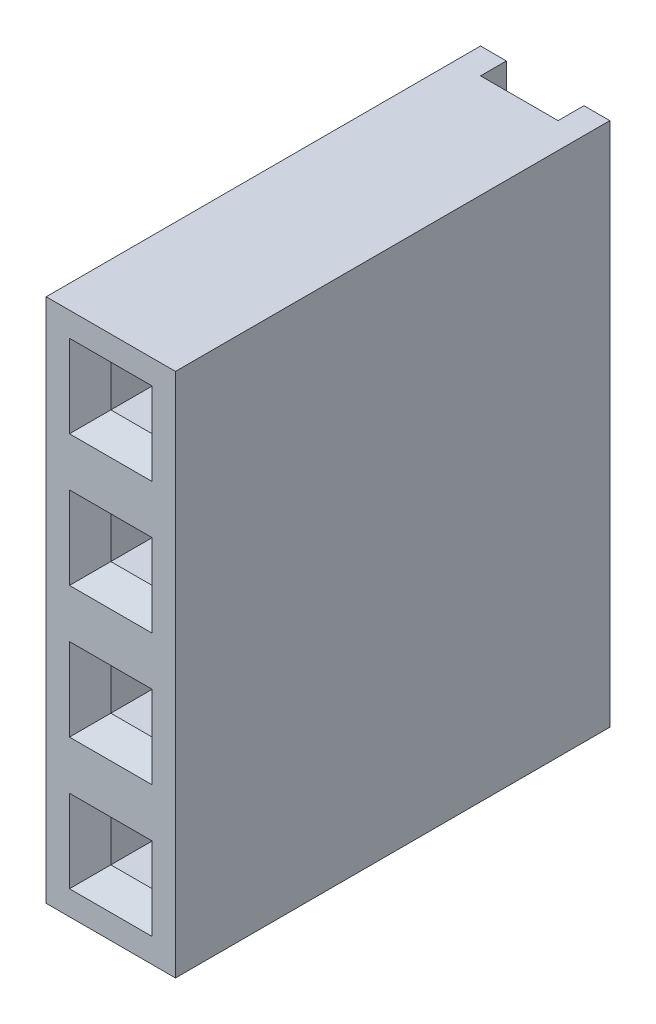
ISO-10303-21;
HEADER;
FILE_DESCRIPTION(('STEP AP214'),'2;1');
FILE_NAME('part.step','',(''),(''),'','','');
FILE_SCHEMA(('AUTOMOTIVE_DESIGN { 1 0 10303 214 1 1 1 1 }'));
ENDSEC;
DATA;
#1=APPLICATION_CONTEXT('core data for automotive mechanical design processes');
#2=APPLICATION_PROTOCOL_DEFINITION('international standard','automotive_design',2000,#1);
#3=PRODUCT_CONTEXT('',#1,'mechanical');
#4=PRODUCT('Part','Part','',(#3));
#5=PRODUCT_RELATED_PRODUCT_CATEGORY('part','',(#4));
#6=PRODUCT_DEFINITION_FORMATION('','',#4);
#7=PRODUCT_DEFINITION_CONTEXT('part definition',#1,'design');
#8=PRODUCT_DEFINITION('design','',#6,#7);
#9=PRODUCT_DEFINITION_SHAPE('','',#8);
#10=(LENGTH_UNIT() NAMED_UNIT(*) SI_UNIT(.MILLI.,.METRE.));
#11=(NAMED_UNIT(*) PLANE_ANGLE_UNIT() SI_UNIT($,.RADIAN.));
#12=(NAMED_UNIT(*) SI_UNIT($,.STERADIAN.) SOLID_ANGLE_UNIT());
#13=UNCERTAINTY_MEASURE_WITH_UNIT(LENGTH_MEASURE(1.E-05),#10,'distance_accuracy_value','');
#14=(GEOMETRIC_REPRESENTATION_CONTEXT(3) GLOBAL_UNCERTAINTY_ASSIGNED_CONTEXT((#13)) GLOBAL_UNIT_ASSIGNED_CONTEXT((#10,
#11,#12)) REPRESENTATION_CONTEXT('',''));
#15=CARTESIAN_POINT('',(0.,0.,0.));
#16=DIRECTION('',(0.,0.,1.));
#17=DIRECTION('',(1.,0.,0.));
#18=AXIS2_PLACEMENT_3D('',#15,#16,#17);
#19=CARTESIAN_POINT('',(-1.25,0.,0.));
#20=DIRECTION('',(1.,0.,0.));
#21=DIRECTION('',(0.,0.,-1.));
#22=AXIS2_PLACEMENT_3D('',#19,#20,#21);
#23=PLANE('',#22);
#24=DIRECTION('',(0.,0.,1.));
#25=VECTOR('',#24,1.);
#26=CARTESIAN_POINT('',(-1.25,12.7,0.));
#27=LINE('',#26,#25);
#28=CARTESIAN_POINT('',(-1.25,12.7,0.));
#29=VERTEX_POINT('',#28);
#30=CARTESIAN_POINT('',(-1.25,12.7,8.4));
#31=VERTEX_POINT('',#30);
#32=EDGE_CURVE('E11',#29,#31,#27,.T.);
#33=ORIENTED_EDGE('',*,*,#32,.F.);
#34=DIRECTION('',(0.,1.,0.));
#35=VECTOR('',#34,1.);
#36=CARTESIAN_POINT('',(-1.25,0.,0.));
#37=LINE('',#36,#35);
#38=CARTESIAN_POINT('',(-1.25,2.54,0.));
#39=VERTEX_POINT('',#38);
#40=EDGE_CURVE('E24',#39,#29,#37,.T.);
#41=ORIENTED_EDGE('',*,*,#40,.F.);
#42=DIRECTION('',(0.,0.,-1.));
#43=VECTOR('',#42,1.);
#44=CARTESIAN_POINT('',(-1.25,2.54,0.));
#45=LINE('',#44,#43);
#46=CARTESIAN_POINT('',(-1.25,2.54,8.4));
#47=VERTEX_POINT('',#46);
#48=EDGE_CURVE('E499',#47,#39,#45,.T.);
#49=ORIENTED_EDGE('',*,*,#48,.F.);
#50=DIRECTION('',(0.,-1.,0.));
#51=VECTOR('',#50,1.);
#52=CARTESIAN_POINT('',(-1.25,0.,8.4));
#53=LINE('',#52,#51);
#54=EDGE_CURVE('E496',#31,#47,#53,.T.);
#55=ORIENTED_EDGE('',*,*,#54,.F.);
#56=EDGE_LOOP('',(#33,#41,#49,#55));
#57=FACE_BOUND('',#56,.T.);
#58=ADVANCED_FACE('F17',(#57),#23,.F.);
#59=CARTESIAN_POINT('',(0.,2.54,8.4));
#60=DIRECTION('',(0.,0.,-1.));
#61=DIRECTION('',(-1.,0.,0.));
#62=AXIS2_PLACEMENT_3D('',#59,#60,#61);
#63=PLANE('',#62);
#64=DIRECTION('',(1.,0.,0.));
#65=VECTOR('',#64,1.);
#66=CARTESIAN_POINT('',(0.,10.63,8.4));
#67=LINE('',#66,#65);
#68=CARTESIAN_POINT('',(-0.8,10.63,8.4));
#69=VERTEX_POINT('',#68);
#70=CARTESIAN_POINT('',(0.800000000000001,10.63,8.4));
#71=VERTEX_POINT('',#70);
#72=EDGE_CURVE('E494',#69,#71,#67,.T.);
#73=ORIENTED_EDGE('',*,*,#72,.F.);
#74=DIRECTION('',(0.,-1.,0.));
#75=VECTOR('',#74,1.);
#76=CARTESIAN_POINT('',(-0.8,2.54,8.4));
#77=LINE('',#76,#75);
#78=CARTESIAN_POINT('',(-0.800000000000001,12.23,8.4));
#79=VERTEX_POINT('',#78);
#80=EDGE_CURVE('E491',#79,#69,#77,.T.);
#81=ORIENTED_EDGE('',*,*,#80,.F.);
#82=DIRECTION('',(-1.,0.,0.));
#83=VECTOR('',#82,1.);
#84=CARTESIAN_POINT('',(0.,12.23,8.4));
#85=LINE('',#84,#83);
#86=CARTESIAN_POINT('',(0.8,12.23,8.4));
#87=VERTEX_POINT('',#86);
#88=EDGE_CURVE('E488',#87,#79,#85,.T.);
#89=ORIENTED_EDGE('',*,*,#88,.F.);
#90=DIRECTION('',(0.,1.,0.));
#91=VECTOR('',#90,1.);
#92=CARTESIAN_POINT('',(0.8,2.54,8.4));
#93=LINE('',#92,#91);
#94=EDGE_CURVE('E485',#71,#87,#93,.T.);
#95=ORIENTED_EDGE('',*,*,#94,.F.);
#96=EDGE_LOOP('',(#73,#81,#89,#95));
#97=FACE_BOUND('',#96,.T.);
#98=DIRECTION('',(0.,1.,0.));
#99=VECTOR('',#98,1.);
#100=CARTESIAN_POINT('',(0.8,2.54,8.4));
#101=LINE('',#100,#99);
#102=CARTESIAN_POINT('',(0.800000000000001,8.09,8.4));
#103=VERTEX_POINT('',#102);
#104=CARTESIAN_POINT('',(0.8,9.69,8.4));
#105=VERTEX_POINT('',#104);
#106=EDGE_CURVE('E483',#103,#105,#101,.T.);
#107=ORIENTED_EDGE('',*,*,#106,.F.);
#108=DIRECTION('',(1.,0.,0.));
#109=VECTOR('',#108,1.);
#110=CARTESIAN_POINT('',(0.,8.09,8.4));
#111=LINE('',#110,#109);
#112=CARTESIAN_POINT('',(-0.8,8.09,8.4));
#113=VERTEX_POINT('',#112);
#114=EDGE_CURVE('E480',#113,#103,#111,.T.);
#115=ORIENTED_EDGE('',*,*,#114,.F.);
#116=DIRECTION('',(0.,-1.,0.));
#117=VECTOR('',#116,1.);
#118=CARTESIAN_POINT('',(-0.8,2.54,8.4));
#119=LINE('',#118,#117);
#120=CARTESIAN_POINT('',(-0.800000000000001,9.69,8.4));
#121=VERTEX_POINT('',#120);
#122=EDGE_CURVE('E477',#121,#113,#119,.T.);
#123=ORIENTED_EDGE('',*,*,#122,.F.);
#124=DIRECTION('',(-1.,0.,0.));
#125=VECTOR('',#124,1.);
#126=CARTESIAN_POINT('',(0.,9.69,8.4));
#127=LINE('',#126,#125);
#128=EDGE_CURVE('E474',#105,#121,#127,.T.);
#129=ORIENTED_EDGE('',*,*,#128,.F.);
#130=EDGE_LOOP('',(#107,#115,#123,#129));
#131=FACE_BOUND('',#130,.T.);
#132=DIRECTION('',(0.,1.,0.));
#133=VECTOR('',#132,1.);
#134=CARTESIAN_POINT('',(0.8,2.54,8.4));
#135=LINE('',#134,#133);
#136=CARTESIAN_POINT('',(0.800000000000001,5.55,8.4));
#137=VERTEX_POINT('',#136);
#138=CARTESIAN_POINT('',(0.8,7.15,8.4));
#139=VERTEX_POINT('',#138);
#140=EDGE_CURVE('E472',#137,#139,#135,.T.);
#141=ORIENTED_EDGE('',*,*,#140,.F.);
#142=DIRECTION('',(1.,0.,0.));
#143=VECTOR('',#142,1.);
#144=CARTESIAN_POINT('',(0.,5.55,8.4));
#145=LINE('',#144,#143);
#146=CARTESIAN_POINT('',(-0.8,5.55,8.4));
#147=VERTEX_POINT('',#146);
#148=EDGE_CURVE('E469',#147,#137,#145,.T.);
#149=ORIENTED_EDGE('',*,*,#148,.F.);
#150=DIRECTION('',(0.,-1.,0.));
#151=VECTOR('',#150,1.);
#152=CARTESIAN_POINT('',(-0.8,2.54,8.4));
#153=LINE('',#152,#151);
#154=CARTESIAN_POINT('',(-0.800000000000001,7.15,8.4));
#155=VERTEX_POINT('',#154);
#156=EDGE_CURVE('E466',#155,#147,#153,.T.);
#157=ORIENTED_EDGE('',*,*,#156,.F.);
#158=DIRECTION('',(-1.,0.,0.));
#159=VECTOR('',#158,1.);
#160=CARTESIAN_POINT('',(0.,7.15,8.4));
#161=LINE('',#160,#159);
#162=EDGE_CURVE('E463',#139,#155,#161,.T.);
#163=ORIENTED_EDGE('',*,*,#162,.F.);
#164=EDGE_LOOP('',(#141,#149,#157,#163));
#165=FACE_BOUND('',#164,.T.);
#166=DIRECTION('',(0.,1.,0.));
#167=VECTOR('',#166,1.);
#168=CARTESIAN_POINT('',(0.8,2.54,8.4));
#169=LINE('',#168,#167);
#170=CARTESIAN_POINT('',(0.800000000000002,3.01,8.4));
#171=VERTEX_POINT('',#170);
#172=CARTESIAN_POINT('',(0.8,4.61,8.4));
#173=VERTEX_POINT('',#172);
#174=EDGE_CURVE('E461',#171,#173,#169,.T.);
#175=ORIENTED_EDGE('',*,*,#174,.F.);
#176=DIRECTION('',(1.,0.,0.));
#177=VECTOR('',#176,1.);
#178=CARTESIAN_POINT('',(0.,3.01,8.4));
#179=LINE('',#178,#177);
#180=CARTESIAN_POINT('',(-0.8,3.01,8.4));
#181=VERTEX_POINT('',#180);
#182=EDGE_CURVE('E458',#181,#171,#179,.T.);
#183=ORIENTED_EDGE('',*,*,#182,.F.);
#184=DIRECTION('',(0.,-1.,0.));
#185=VECTOR('',#184,1.);
#186=CARTESIAN_POINT('',(-0.8,2.54,8.4));
#187=LINE('',#186,#185);
#188=CARTESIAN_POINT('',(-0.800000000000001,4.61,8.4));
#189=VERTEX_POINT('',#188);
#190=EDGE_CURVE('E455',#189,#181,#187,.T.);
#191=ORIENTED_EDGE('',*,*,#190,.F.);
#192=DIRECTION('',(-1.,0.,0.));
#193=VECTOR('',#192,1.);
#194=CARTESIAN_POINT('',(0.,4.61,8.4));
#195=LINE('',#194,#193);
#196=EDGE_CURVE('E452',#173,#189,#195,.T.);
#197=ORIENTED_EDGE('',*,*,#196,.F.);
#198=EDGE_LOOP('',(#175,#183,#191,#197));
#199=FACE_BOUND('',#198,.T.);
#200=ORIENTED_EDGE('',*,*,#54,.T.);
#201=DIRECTION('',(-1.,0.,0.));
#202=VECTOR('',#201,1.);
#203=CARTESIAN_POINT('',(0.,2.54,8.4));
#204=LINE('',#203,#202);
#205=CARTESIAN_POINT('',(1.25,2.54,8.4));
#206=VERTEX_POINT('',#205);
#207=EDGE_CURVE('E449',#206,#47,#204,.T.);
#208=ORIENTED_EDGE('',*,*,#207,.F.);
#209=DIRECTION('',(0.,-1.,0.));
#210=VECTOR('',#209,1.);
#211=CARTESIAN_POINT('',(1.25,2.54,8.4));
#212=LINE('',#211,#210);
#213=CARTESIAN_POINT('',(1.25,12.7,8.4));
#214=VERTEX_POINT('',#213);
#215=EDGE_CURVE('E446',#214,#206,#212,.T.);
#216=ORIENTED_EDGE('',*,*,#215,.F.);
#217=DIRECTION('',(1.,0.,0.));
#218=VECTOR('',#217,1.);
#219=CARTESIAN_POINT('',(0.,12.7,8.4));
#220=LINE('',#219,#218);
#221=EDGE_CURVE('E444',#31,#214,#220,.T.);
#222=ORIENTED_EDGE('',*,*,#221,.F.);
#223=EDGE_LOOP('',(#200,#208,#216,#222));
#224=FACE_BOUND('',#223,.T.);
#225=ADVANCED_FACE('F517',(#97,#131,#165,#199,#224),#63,.F.);
#226=CARTESIAN_POINT('',(0.,12.7,0.));
#227=DIRECTION('',(0.,1.,0.));
#228=DIRECTION('',(0.,0.,1.));
#229=AXIS2_PLACEMENT_3D('',#226,#227,#228);
#230=PLANE('',#229);
#231=DIRECTION('',(1.,0.,0.));
#232=VECTOR('',#231,1.);
#233=CARTESIAN_POINT('',(-0.75,12.7,0.5));
#234=LINE('',#233,#232);
#235=CARTESIAN_POINT('',(-0.75,12.7,0.5));
#236=VERTEX_POINT('',#235);
#237=CARTESIAN_POINT('',(0.75,12.7,0.5));
#238=VERTEX_POINT('',#237);
#239=EDGE_CURVE('E442',#236,#238,#234,.T.);
#240=ORIENTED_EDGE('',*,*,#239,.F.);
#241=DIRECTION('',(0.,0.,1.));
#242=VECTOR('',#241,1.);
#243=CARTESIAN_POINT('',(-0.75,12.7,0.));
#244=LINE('',#243,#242);
#245=CARTESIAN_POINT('',(-0.75,12.7,0.));
#246=VERTEX_POINT('',#245);
#247=EDGE_CURVE('E439',#246,#236,#244,.T.);
#248=ORIENTED_EDGE('',*,*,#247,.F.);
#249=DIRECTION('',(-1.,0.,0.));
#250=VECTOR('',#249,1.);
#251=CARTESIAN_POINT('',(0.,12.7,0.));
#252=LINE('',#251,#250);
#253=EDGE_CURVE('E437',#246,#29,#252,.T.);
#254=ORIENTED_EDGE('',*,*,#253,.T.);
#255=ORIENTED_EDGE('',*,*,#32,.T.);
#256=ORIENTED_EDGE('',*,*,#221,.T.);
#257=DIRECTION('',(0.,0.,-1.));
#258=VECTOR('',#257,1.);
#259=CARTESIAN_POINT('',(1.25,12.7,0.));
#260=LINE('',#259,#258);
#261=CARTESIAN_POINT('',(1.25,12.7,0.));
#262=VERTEX_POINT('',#261);
#263=EDGE_CURVE('E435',#214,#262,#260,.T.);
#264=ORIENTED_EDGE('',*,*,#263,.T.);
#265=DIRECTION('',(-1.,0.,0.));
#266=VECTOR('',#265,1.);
#267=CARTESIAN_POINT('',(0.,12.7,0.));
#268=LINE('',#267,#266);
#269=CARTESIAN_POINT('',(0.75,12.7,0.));
#270=VERTEX_POINT('',#269);
#271=EDGE_CURVE('E433',#262,#270,#268,.T.);
#272=ORIENTED_EDGE('',*,*,#271,.T.);
#273=DIRECTION('',(0.,0.,-1.));
#274=VECTOR('',#273,1.);
#275=CARTESIAN_POINT('',(0.75,12.7,0.5));
#276=LINE('',#275,#274);
#277=EDGE_CURVE('E430',#238,#270,#276,.T.);
#278=ORIENTED_EDGE('',*,*,#277,.F.);
#279=EDGE_LOOP('',(#240,#248,#254,#255,#256,#264,#272,#278));
#280=FACE_BOUND('',#279,.T.);
#281=ADVANCED_FACE('F506',(#280),#230,.T.);
#282=CARTESIAN_POINT('',(0.,12.7,0.));
#283=DIRECTION('',(0.,0.,1.));
#284=DIRECTION('',(1.,0.,0.));
#285=AXIS2_PLACEMENT_3D('',#282,#283,#284);
#286=PLANE('',#285);
#287=DIRECTION('',(1.,0.,0.));
#288=VECTOR('',#287,1.);
#289=CARTESIAN_POINT('',(0.,2.54,0.));
#290=LINE('',#289,#288);
#291=CARTESIAN_POINT('',(-0.75,2.54,0.));
#292=VERTEX_POINT('',#291);
#293=EDGE_CURVE('E428',#39,#292,#290,.T.);
#294=ORIENTED_EDGE('',*,*,#293,.F.);
#295=ORIENTED_EDGE('',*,*,#40,.T.);
#296=ORIENTED_EDGE('',*,*,#253,.F.);
#297=DIRECTION('',(0.,1.,0.));
#298=VECTOR('',#297,1.);
#299=CARTESIAN_POINT('',(-0.75,12.7,0.));
#300=LINE('',#299,#298);
#301=EDGE_CURVE('E425',#292,#246,#300,.T.);
#302=ORIENTED_EDGE('',*,*,#301,.F.);
#303=EDGE_LOOP('',(#294,#295,#296,#302));
#304=FACE_BOUND('',#303,.T.);
#305=ADVANCED_FACE('F504',(#304),#286,.F.);
#306=CARTESIAN_POINT('',(0.,2.54,8.4));
#307=DIRECTION('',(0.,-1.,0.));
#308=DIRECTION('',(0.,0.,-1.));
#309=AXIS2_PLACEMENT_3D('',#306,#307,#308);
#310=PLANE('',#309);
#311=DIRECTION('',(-1.,0.,0.));
#312=VECTOR('',#311,1.);
#313=CARTESIAN_POINT('',(-0.75,2.54,0.5));
#314=LINE('',#313,#312);
#315=CARTESIAN_POINT('',(0.75,2.54,0.5));
#316=VERTEX_POINT('',#315);
#317=CARTESIAN_POINT('',(-0.75,2.54,0.5));
#318=VERTEX_POINT('',#317);
#319=EDGE_CURVE('E423',#316,#318,#314,.T.);
#320=ORIENTED_EDGE('',*,*,#319,.F.);
#321=DIRECTION('',(0.,0.,1.));
#322=VECTOR('',#321,1.);
#323=CARTESIAN_POINT('',(0.75,2.54,0.5));
#324=LINE('',#323,#322);
#325=CARTESIAN_POINT('',(0.75,2.54,0.));
#326=VERTEX_POINT('',#325);
#327=EDGE_CURVE('E420',#326,#316,#324,.T.);
#328=ORIENTED_EDGE('',*,*,#327,.F.);
#329=DIRECTION('',(1.,0.,0.));
#330=VECTOR('',#329,1.);
#331=CARTESIAN_POINT('',(0.,2.54,0.));
#332=LINE('',#331,#330);
#333=CARTESIAN_POINT('',(1.25,2.54,0.));
#334=VERTEX_POINT('',#333);
#335=EDGE_CURVE('E418',#326,#334,#332,.T.);
#336=ORIENTED_EDGE('',*,*,#335,.T.);
#337=DIRECTION('',(0.,0.,1.));
#338=VECTOR('',#337,1.);
#339=CARTESIAN_POINT('',(1.25,2.54,8.4));
#340=LINE('',#339,#338);
#341=EDGE_CURVE('E415',#334,#206,#340,.T.);
#342=ORIENTED_EDGE('',*,*,#341,.T.);
#343=ORIENTED_EDGE('',*,*,#207,.T.);
#344=ORIENTED_EDGE('',*,*,#48,.T.);
#345=ORIENTED_EDGE('',*,*,#293,.T.);
#346=DIRECTION('',(0.,0.,1.));
#347=VECTOR('',#346,1.);
#348=CARTESIAN_POINT('',(-0.75,2.54,8.4));
#349=LINE('',#348,#347);
#350=EDGE_CURVE('E412',#292,#318,#349,.T.);
#351=ORIENTED_EDGE('',*,*,#350,.T.);
#352=EDGE_LOOP('',(#320,#328,#336,#342,#343,#344,#345,#351));
#353=FACE_BOUND('',#352,.T.);
#354=ADVANCED_FACE('F514',(#353),#310,.T.);
#355=CARTESIAN_POINT('',(0.4,14.732,8.));
#356=DIRECTION('',(-0.707106781186548,0.,0.707106781186548));
#357=DIRECTION('',(0.707106781186548,0.,0.707106781186548));
#358=AXIS2_PLACEMENT_3D('',#355,#356,#357);
#359=PLANE('',#358);
#360=DIRECTION('',(0.577350269189626,-0.577350269189624,0.577350269189627));
#361=VECTOR('',#360,1.);
#362=CARTESIAN_POINT('',(0.4,11.03,8.));
#363=LINE('',#362,#361);
#364=CARTESIAN_POINT('',(0.4,11.03,8.));
#365=VERTEX_POINT('',#364);
#366=EDGE_CURVE('E409',#365,#71,#363,.T.);
#367=ORIENTED_EDGE('',*,*,#366,.T.);
#368=ORIENTED_EDGE('',*,*,#94,.T.);
#369=DIRECTION('',(-0.577350269189626,-0.577350269189626,-0.577350269189626));
#370=VECTOR('',#369,1.);
#371=CARTESIAN_POINT('',(0.800000000000001,12.23,8.4));
#372=LINE('',#371,#370);
#373=CARTESIAN_POINT('',(0.4,11.83,8.));
#374=VERTEX_POINT('',#373);
#375=EDGE_CURVE('E407',#87,#374,#372,.T.);
#376=ORIENTED_EDGE('',*,*,#375,.T.);
#377=DIRECTION('',(0.,-1.,0.));
#378=VECTOR('',#377,1.);
#379=CARTESIAN_POINT('',(0.4,14.732,8.));
#380=LINE('',#379,#378);
#381=EDGE_CURVE('E404',#374,#365,#380,.T.);
#382=ORIENTED_EDGE('',*,*,#381,.T.);
#383=EDGE_LOOP('',(#367,#368,#376,#382));
#384=FACE_BOUND('',#383,.T.);
#385=ADVANCED_FACE('F558',(#384),#359,.T.);
#386=CARTESIAN_POINT('',(-1.75,11.03,8.));
#387=DIRECTION('',(0.,-0.707106781186548,-0.707106781186548));
#388=DIRECTION('',(0.,0.707106781186548,-0.707106781186548));
#389=AXIS2_PLACEMENT_3D('',#386,#387,#388);
#390=PLANE('',#389);
#391=DIRECTION('',(0.577350269189625,0.577350269189626,-0.577350269189626));
#392=VECTOR('',#391,1.);
#393=CARTESIAN_POINT('',(-0.8,10.63,8.4));
#394=LINE('',#393,#392);
#395=CARTESIAN_POINT('',(-0.4,11.03,8.));
#396=VERTEX_POINT('',#395);
#397=EDGE_CURVE('E402',#69,#396,#394,.T.);
#398=ORIENTED_EDGE('',*,*,#397,.F.);
#399=ORIENTED_EDGE('',*,*,#72,.T.);
#400=ORIENTED_EDGE('',*,*,#366,.F.);
#401=DIRECTION('',(-1.,0.,0.));
#402=VECTOR('',#401,1.);
#403=CARTESIAN_POINT('',(0.4,11.03,8.));
#404=LINE('',#403,#402);
#405=EDGE_CURVE('E399',#365,#396,#404,.T.);
#406=ORIENTED_EDGE('',*,*,#405,.T.);
#407=EDGE_LOOP('',(#398,#399,#400,#406));
#408=FACE_BOUND('',#407,.T.);
#409=ADVANCED_FACE('F561',(#408),#390,.F.);
#410=CARTESIAN_POINT('',(-0.4,0.508,8.));
#411=DIRECTION('',(0.707106781186548,0.,0.707106781186548));
#412=DIRECTION('',(0.707106781186548,0.,-0.707106781186548));
#413=AXIS2_PLACEMENT_3D('',#410,#411,#412);
#414=PLANE('',#413);
#415=DIRECTION('',(-0.577350269189624,0.577350269189629,0.577350269189624));
#416=VECTOR('',#415,1.);
#417=CARTESIAN_POINT('',(-0.4,11.83,8.));
#418=LINE('',#417,#416);
#419=CARTESIAN_POINT('',(-0.4,11.83,8.));
#420=VERTEX_POINT('',#419);
#421=EDGE_CURVE('E396',#420,#79,#418,.T.);
#422=ORIENTED_EDGE('',*,*,#421,.T.);
#423=ORIENTED_EDGE('',*,*,#80,.T.);
#424=ORIENTED_EDGE('',*,*,#397,.T.);
#425=DIRECTION('',(0.,-1.,0.));
#426=VECTOR('',#425,1.);
#427=CARTESIAN_POINT('',(-0.4,11.83,8.));
#428=LINE('',#427,#426);
#429=EDGE_CURVE('E394',#420,#396,#428,.T.);
#430=ORIENTED_EDGE('',*,*,#429,.F.);
#431=EDGE_LOOP('',(#422,#423,#424,#430));
#432=FACE_BOUND('',#431,.T.);
#433=ADVANCED_FACE('F565',(#432),#414,.T.);
#434=CARTESIAN_POINT('',(1.75,11.83,8.));
#435=DIRECTION('',(0.,0.707106781186548,-0.707106781186548));
#436=DIRECTION('',(0.,0.707106781186548,0.707106781186548));
#437=AXIS2_PLACEMENT_3D('',#434,#435,#436);
#438=PLANE('',#437);
#439=ORIENTED_EDGE('',*,*,#375,.F.);
#440=ORIENTED_EDGE('',*,*,#88,.T.);
#441=ORIENTED_EDGE('',*,*,#421,.F.);
#442=DIRECTION('',(1.,0.,0.));
#443=VECTOR('',#442,1.);
#444=CARTESIAN_POINT('',(-0.4,11.83,8.));
#445=LINE('',#444,#443);
#446=EDGE_CURVE('E249',#420,#374,#445,.T.);
#447=ORIENTED_EDGE('',*,*,#446,.T.);
#448=EDGE_LOOP('',(#439,#440,#441,#447));
#449=FACE_BOUND('',#448,.T.);
#450=ADVANCED_FACE('F569',(#449),#438,.F.);
#451=CARTESIAN_POINT('',(1.75,9.29,8.));
#452=DIRECTION('',(0.,0.707106781186548,-0.707106781186548));
#453=DIRECTION('',(0.,0.707106781186548,0.707106781186548));
#454=AXIS2_PLACEMENT_3D('',#451,#452,#453);
#455=PLANE('',#454);
#456=DIRECTION('',(-0.577350269189625,-0.577350269189626,-0.577350269189626));
#457=VECTOR('',#456,1.);
#458=CARTESIAN_POINT('',(0.8,9.69,8.4));
#459=LINE('',#458,#457);
#460=CARTESIAN_POINT('',(0.4,9.29,8.));
#461=VERTEX_POINT('',#460);
#462=EDGE_CURVE('E391',#105,#461,#459,.T.);
#463=ORIENTED_EDGE('',*,*,#462,.F.);
#464=ORIENTED_EDGE('',*,*,#128,.T.);
#465=DIRECTION('',(-0.577350269189625,0.577350269189626,0.577350269189626));
#466=VECTOR('',#465,1.);
#467=CARTESIAN_POINT('',(-0.400000000000001,9.29,8.));
#468=LINE('',#467,#466);
#469=CARTESIAN_POINT('',(-0.4,9.29,8.));
#470=VERTEX_POINT('',#469);
#471=EDGE_CURVE('E388',#470,#121,#468,.T.);
#472=ORIENTED_EDGE('',*,*,#471,.F.);
#473=DIRECTION('',(-1.,0.,0.));
#474=VECTOR('',#473,1.);
#475=CARTESIAN_POINT('',(1.75,9.29,8.));
#476=LINE('',#475,#474);
#477=EDGE_CURVE('E385',#461,#470,#476,.T.);
#478=ORIENTED_EDGE('',*,*,#477,.F.);
#479=EDGE_LOOP('',(#463,#464,#472,#478));
#480=FACE_BOUND('',#479,.T.);
#481=ADVANCED_FACE('F573',(#480),#455,.F.);
#482=CARTESIAN_POINT('',(0.4,14.732,8.));
#483=DIRECTION('',(-0.707106781186548,0.,0.707106781186548));
#484=DIRECTION('',(0.707106781186548,0.,0.707106781186548));
#485=AXIS2_PLACEMENT_3D('',#482,#483,#484);
#486=PLANE('',#485);
#487=DIRECTION('',(0.577350269189626,-0.577350269189626,0.577350269189626));
#488=VECTOR('',#487,1.);
#489=CARTESIAN_POINT('',(0.4,8.49,8.));
#490=LINE('',#489,#488);
#491=CARTESIAN_POINT('',(0.4,8.49,8.));
#492=VERTEX_POINT('',#491);
#493=EDGE_CURVE('E382',#492,#103,#490,.T.);
#494=ORIENTED_EDGE('',*,*,#493,.T.);
#495=ORIENTED_EDGE('',*,*,#106,.T.);
#496=ORIENTED_EDGE('',*,*,#462,.T.);
#497=DIRECTION('',(0.,1.,0.));
#498=VECTOR('',#497,1.);
#499=CARTESIAN_POINT('',(0.4,11.03,8.));
#500=LINE('',#499,#498);
#501=EDGE_CURVE('E379',#492,#461,#500,.T.);
#502=ORIENTED_EDGE('',*,*,#501,.F.);
#503=EDGE_LOOP('',(#494,#495,#496,#502));
#504=FACE_BOUND('',#503,.T.);
#505=ADVANCED_FACE('F577',(#504),#486,.T.);
#506=CARTESIAN_POINT('',(-1.75,8.49,8.));
#507=DIRECTION('',(0.,-0.707106781186548,-0.707106781186548));
#508=DIRECTION('',(0.,0.707106781186548,-0.707106781186548));
#509=AXIS2_PLACEMENT_3D('',#506,#507,#508);
#510=PLANE('',#509);
#511=DIRECTION('',(0.577350269189625,0.577350269189626,-0.577350269189626));
#512=VECTOR('',#511,1.);
#513=CARTESIAN_POINT('',(-0.8,8.09,8.4));
#514=LINE('',#513,#512);
#515=CARTESIAN_POINT('',(-0.4,8.49,8.));
#516=VERTEX_POINT('',#515);
#517=EDGE_CURVE('E377',#113,#516,#514,.T.);
#518=ORIENTED_EDGE('',*,*,#517,.F.);
#519=ORIENTED_EDGE('',*,*,#114,.T.);
#520=ORIENTED_EDGE('',*,*,#493,.F.);
#521=DIRECTION('',(-1.,0.,0.));
#522=VECTOR('',#521,1.);
#523=CARTESIAN_POINT('',(0.4,8.49,8.));
#524=LINE('',#523,#522);
#525=EDGE_CURVE('E374',#492,#516,#524,.T.);
#526=ORIENTED_EDGE('',*,*,#525,.T.);
#527=EDGE_LOOP('',(#518,#519,#520,#526));
#528=FACE_BOUND('',#527,.T.);
#529=ADVANCED_FACE('F581',(#528),#510,.F.);
#530=CARTESIAN_POINT('',(-0.4,0.508,8.));
#531=DIRECTION('',(0.707106781186548,0.,0.707106781186548));
#532=DIRECTION('',(0.707106781186548,0.,-0.707106781186548));
#533=AXIS2_PLACEMENT_3D('',#530,#531,#532);
#534=PLANE('',#533);
#535=ORIENTED_EDGE('',*,*,#471,.T.);
#536=ORIENTED_EDGE('',*,*,#122,.T.);
#537=ORIENTED_EDGE('',*,*,#517,.T.);
#538=DIRECTION('',(0.,-1.,0.));
#539=VECTOR('',#538,1.);
#540=CARTESIAN_POINT('',(-0.4,11.83,8.));
#541=LINE('',#540,#539);
#542=EDGE_CURVE('E371',#470,#516,#541,.T.);
#543=ORIENTED_EDGE('',*,*,#542,.F.);
#544=EDGE_LOOP('',(#535,#536,#537,#543));
#545=FACE_BOUND('',#544,.T.);
#546=ADVANCED_FACE('F585',(#545),#534,.T.);
#547=CARTESIAN_POINT('',(1.75,6.75,8.));
#548=DIRECTION('',(0.,0.707106781186548,-0.707106781186548));
#549=DIRECTION('',(0.,0.707106781186548,0.707106781186548));
#550=AXIS2_PLACEMENT_3D('',#547,#548,#549);
#551=PLANE('',#550);
#552=DIRECTION('',(-0.577350269189625,-0.577350269189626,-0.577350269189626));
#553=VECTOR('',#552,1.);
#554=CARTESIAN_POINT('',(0.8,7.15,8.4));
#555=LINE('',#554,#553);
#556=CARTESIAN_POINT('',(0.4,6.75,8.));
#557=VERTEX_POINT('',#556);
#558=EDGE_CURVE('E369',#139,#557,#555,.T.);
#559=ORIENTED_EDGE('',*,*,#558,.F.);
#560=ORIENTED_EDGE('',*,*,#162,.T.);
#561=DIRECTION('',(-0.577350269189625,0.577350269189626,0.577350269189626));
#562=VECTOR('',#561,1.);
#563=CARTESIAN_POINT('',(-0.400000000000001,6.75,8.));
#564=LINE('',#563,#562);
#565=CARTESIAN_POINT('',(-0.4,6.75,8.));
#566=VERTEX_POINT('',#565);
#567=EDGE_CURVE('E366',#566,#155,#564,.T.);
#568=ORIENTED_EDGE('',*,*,#567,.F.);
#569=DIRECTION('',(-1.,0.,0.));
#570=VECTOR('',#569,1.);
#571=CARTESIAN_POINT('',(1.75,6.75,8.));
#572=LINE('',#571,#570);
#573=EDGE_CURVE('E363',#557,#566,#572,.T.);
#574=ORIENTED_EDGE('',*,*,#573,.F.);
#575=EDGE_LOOP('',(#559,#560,#568,#574));
#576=FACE_BOUND('',#575,.T.);
#577=ADVANCED_FACE('F589',(#576),#551,.F.);
#578=CARTESIAN_POINT('',(0.4,14.732,8.));
#579=DIRECTION('',(-0.707106781186548,0.,0.707106781186548));
#580=DIRECTION('',(0.707106781186548,0.,0.707106781186548));
#581=AXIS2_PLACEMENT_3D('',#578,#579,#580);
#582=PLANE('',#581);
#583=DIRECTION('',(0.577350269189626,-0.577350269189624,0.577350269189627));
#584=VECTOR('',#583,1.);
#585=CARTESIAN_POINT('',(0.4,5.95,8.));
#586=LINE('',#585,#584);
#587=CARTESIAN_POINT('',(0.4,5.95,8.));
#588=VERTEX_POINT('',#587);
#589=EDGE_CURVE('E360',#588,#137,#586,.T.);
#590=ORIENTED_EDGE('',*,*,#589,.T.);
#591=ORIENTED_EDGE('',*,*,#140,.T.);
#592=ORIENTED_EDGE('',*,*,#558,.T.);
#593=DIRECTION('',(0.,1.,0.));
#594=VECTOR('',#593,1.);
#595=CARTESIAN_POINT('',(0.4,11.03,8.));
#596=LINE('',#595,#594);
#597=EDGE_CURVE('E357',#588,#557,#596,.T.);
#598=ORIENTED_EDGE('',*,*,#597,.F.);
#599=EDGE_LOOP('',(#590,#591,#592,#598));
#600=FACE_BOUND('',#599,.T.);
#601=ADVANCED_FACE('F593',(#600),#582,.T.);
#602=CARTESIAN_POINT('',(-1.75,5.95,8.));
#603=DIRECTION('',(0.,-0.707106781186548,-0.707106781186548));
#604=DIRECTION('',(0.,0.707106781186548,-0.707106781186548));
#605=AXIS2_PLACEMENT_3D('',#602,#603,#604);
#606=PLANE('',#605);
#607=DIRECTION('',(0.577350269189625,0.577350269189626,-0.577350269189626));
#608=VECTOR('',#607,1.);
#609=CARTESIAN_POINT('',(-0.8,5.55,8.4));
#610=LINE('',#609,#608);
#611=CARTESIAN_POINT('',(-0.4,5.95,8.));
#612=VERTEX_POINT('',#611);
#613=EDGE_CURVE('E355',#147,#612,#610,.T.);
#614=ORIENTED_EDGE('',*,*,#613,.F.);
#615=ORIENTED_EDGE('',*,*,#148,.T.);
#616=ORIENTED_EDGE('',*,*,#589,.F.);
#617=DIRECTION('',(-1.,0.,0.));
#618=VECTOR('',#617,1.);
#619=CARTESIAN_POINT('',(0.4,5.95,8.));
#620=LINE('',#619,#618);
#621=EDGE_CURVE('E352',#588,#612,#620,.T.);
#622=ORIENTED_EDGE('',*,*,#621,.T.);
#623=EDGE_LOOP('',(#614,#615,#616,#622));
#624=FACE_BOUND('',#623,.T.);
#625=ADVANCED_FACE('F597',(#624),#606,.F.);
#626=CARTESIAN_POINT('',(-0.4,0.508,8.));
#627=DIRECTION('',(0.707106781186548,0.,0.707106781186548));
#628=DIRECTION('',(0.707106781186548,0.,-0.707106781186548));
#629=AXIS2_PLACEMENT_3D('',#626,#627,#628);
#630=PLANE('',#629);
#631=ORIENTED_EDGE('',*,*,#567,.T.);
#632=ORIENTED_EDGE('',*,*,#156,.T.);
#633=ORIENTED_EDGE('',*,*,#613,.T.);
#634=DIRECTION('',(0.,-1.,0.));
#635=VECTOR('',#634,1.);
#636=CARTESIAN_POINT('',(-0.4,11.83,8.));
#637=LINE('',#636,#635);
#638=EDGE_CURVE('E349',#566,#612,#637,.T.);
#639=ORIENTED_EDGE('',*,*,#638,.F.);
#640=EDGE_LOOP('',(#631,#632,#633,#639));
#641=FACE_BOUND('',#640,.T.);
#642=ADVANCED_FACE('F601',(#641),#630,.T.);
#643=CARTESIAN_POINT('',(1.75,4.21,8.));
#644=DIRECTION('',(0.,0.707106781186548,-0.707106781186548));
#645=DIRECTION('',(0.,0.707106781186548,0.707106781186548));
#646=AXIS2_PLACEMENT_3D('',#643,#644,#645);
#647=PLANE('',#646);
#648=DIRECTION('',(-0.577350269189625,-0.577350269189626,-0.577350269189626));
#649=VECTOR('',#648,1.);
#650=CARTESIAN_POINT('',(0.8,4.61,8.4));
#651=LINE('',#650,#649);
#652=CARTESIAN_POINT('',(0.4,4.21,8.));
#653=VERTEX_POINT('',#652);
#654=EDGE_CURVE('E347',#173,#653,#651,.T.);
#655=ORIENTED_EDGE('',*,*,#654,.F.);
#656=ORIENTED_EDGE('',*,*,#196,.T.);
#657=DIRECTION('',(-0.577350269189625,0.577350269189626,0.577350269189626));
#658=VECTOR('',#657,1.);
#659=CARTESIAN_POINT('',(-0.400000000000001,4.21,8.));
#660=LINE('',#659,#658);
#661=CARTESIAN_POINT('',(-0.4,4.21,8.));
#662=VERTEX_POINT('',#661);
#663=EDGE_CURVE('E344',#662,#189,#660,.T.);
#664=ORIENTED_EDGE('',*,*,#663,.F.);
#665=DIRECTION('',(-1.,0.,0.));
#666=VECTOR('',#665,1.);
#667=CARTESIAN_POINT('',(1.75,4.21,8.));
#668=LINE('',#667,#666);
#669=EDGE_CURVE('E341',#653,#662,#668,.T.);
#670=ORIENTED_EDGE('',*,*,#669,.F.);
#671=EDGE_LOOP('',(#655,#656,#664,#670));
#672=FACE_BOUND('',#671,.T.);
#673=ADVANCED_FACE('F605',(#672),#647,.F.);
#674=CARTESIAN_POINT('',(0.4,14.732,8.));
#675=DIRECTION('',(-0.707106781186548,0.,0.707106781186548));
#676=DIRECTION('',(0.707106781186548,0.,0.707106781186548));
#677=AXIS2_PLACEMENT_3D('',#674,#675,#676);
#678=PLANE('',#677);
#679=DIRECTION('',(0.577350269189625,-0.577350269189628,0.577350269189625));
#680=VECTOR('',#679,1.);
#681=CARTESIAN_POINT('',(0.4,3.41,8.));
#682=LINE('',#681,#680);
#683=CARTESIAN_POINT('',(0.4,3.41,8.));
#684=VERTEX_POINT('',#683);
#685=EDGE_CURVE('E338',#684,#171,#682,.T.);
#686=ORIENTED_EDGE('',*,*,#685,.T.);
#687=ORIENTED_EDGE('',*,*,#174,.T.);
#688=ORIENTED_EDGE('',*,*,#654,.T.);
#689=DIRECTION('',(0.,1.,0.));
#690=VECTOR('',#689,1.);
#691=CARTESIAN_POINT('',(0.4,11.03,8.));
#692=LINE('',#691,#690);
#693=EDGE_CURVE('E335',#684,#653,#692,.T.);
#694=ORIENTED_EDGE('',*,*,#693,.F.);
#695=EDGE_LOOP('',(#686,#687,#688,#694));
#696=FACE_BOUND('',#695,.T.);
#697=ADVANCED_FACE('F609',(#696),#678,.T.);
#698=CARTESIAN_POINT('',(-1.75,3.41,8.));
#699=DIRECTION('',(0.,-0.707106781186548,-0.707106781186548));
#700=DIRECTION('',(0.,0.707106781186548,-0.707106781186548));
#701=AXIS2_PLACEMENT_3D('',#698,#699,#700);
#702=PLANE('',#701);
#703=DIRECTION('',(0.577350269189625,0.577350269189626,-0.577350269189626));
#704=VECTOR('',#703,1.);
#705=CARTESIAN_POINT('',(-0.8,3.01,8.4));
#706=LINE('',#705,#704);
#707=CARTESIAN_POINT('',(-0.4,3.41,8.));
#708=VERTEX_POINT('',#707);
#709=EDGE_CURVE('E333',#181,#708,#706,.T.);
#710=ORIENTED_EDGE('',*,*,#709,.F.);
#711=ORIENTED_EDGE('',*,*,#182,.T.);
#712=ORIENTED_EDGE('',*,*,#685,.F.);
#713=DIRECTION('',(-1.,0.,0.));
#714=VECTOR('',#713,1.);
#715=CARTESIAN_POINT('',(0.4,3.41,8.));
#716=LINE('',#715,#714);
#717=EDGE_CURVE('E330',#684,#708,#716,.T.);
#718=ORIENTED_EDGE('',*,*,#717,.T.);
#719=EDGE_LOOP('',(#710,#711,#712,#718));
#720=FACE_BOUND('',#719,.T.);
#721=ADVANCED_FACE('F613',(#720),#702,.F.);
#722=CARTESIAN_POINT('',(-0.4,0.508,8.));
#723=DIRECTION('',(0.707106781186548,0.,0.707106781186548));
#724=DIRECTION('',(0.707106781186548,0.,-0.707106781186548));
#725=AXIS2_PLACEMENT_3D('',#722,#723,#724);
#726=PLANE('',#725);
#727=ORIENTED_EDGE('',*,*,#663,.T.);
#728=ORIENTED_EDGE('',*,*,#190,.T.);
#729=ORIENTED_EDGE('',*,*,#709,.T.);
#730=DIRECTION('',(0.,-1.,0.));
#731=VECTOR('',#730,1.);
#732=CARTESIAN_POINT('',(-0.4,11.83,8.));
#733=LINE('',#732,#731);
#734=EDGE_CURVE('E327',#662,#708,#733,.T.);
#735=ORIENTED_EDGE('',*,*,#734,.F.);
#736=EDGE_LOOP('',(#727,#728,#729,#735));
#737=FACE_BOUND('',#736,.T.);
#738=ADVANCED_FACE('F617',(#737),#726,.T.);
#739=CARTESIAN_POINT('',(1.25,0.,0.));
#740=DIRECTION('',(1.,0.,0.));
#741=DIRECTION('',(0.,0.,-1.));
#742=AXIS2_PLACEMENT_3D('',#739,#740,#741);
#743=PLANE('',#742);
#744=ORIENTED_EDGE('',*,*,#263,.F.);
#745=ORIENTED_EDGE('',*,*,#215,.T.);
#746=ORIENTED_EDGE('',*,*,#341,.F.);
#747=DIRECTION('',(0.,1.,0.));
#748=VECTOR('',#747,1.);
#749=CARTESIAN_POINT('',(1.25,0.,0.));
#750=LINE('',#749,#748);
#751=EDGE_CURVE('E324',#334,#262,#750,.T.);
#752=ORIENTED_EDGE('',*,*,#751,.T.);
#753=EDGE_LOOP('',(#744,#745,#746,#752));
#754=FACE_BOUND('',#753,.T.);
#755=ADVANCED_FACE('F521',(#754),#743,.T.);
#756=CARTESIAN_POINT('',(-0.75,12.7,0.));
#757=DIRECTION('',(1.,0.,0.));
#758=DIRECTION('',(0.,0.,-1.));
#759=AXIS2_PLACEMENT_3D('',#756,#757,#758);
#760=PLANE('',#759);
#761=DIRECTION('',(0.,-1.,0.));
#762=VECTOR('',#761,1.);
#763=CARTESIAN_POINT('',(-0.75,12.7,0.5));
#764=LINE('',#763,#762);
#765=EDGE_CURVE('E321',#236,#318,#764,.T.);
#766=ORIENTED_EDGE('',*,*,#765,.T.);
#767=ORIENTED_EDGE('',*,*,#350,.F.);
#768=ORIENTED_EDGE('',*,*,#301,.T.);
#769=ORIENTED_EDGE('',*,*,#247,.T.);
#770=EDGE_LOOP('',(#766,#767,#768,#769));
#771=FACE_BOUND('',#770,.T.);
#772=ADVANCED_FACE('F510',(#771),#760,.T.);
#773=CARTESIAN_POINT('',(0.4,11.03,8.4));
#774=DIRECTION('',(-1.,0.,0.));
#775=DIRECTION('',(0.,0.,1.));
#776=AXIS2_PLACEMENT_3D('',#773,#774,#775);
#777=PLANE('',#776);
#778=DIRECTION('',(0.,0.,1.));
#779=VECTOR('',#778,1.);
#780=CARTESIAN_POINT('',(0.4,11.03,8.4));
#781=LINE('',#780,#779);
#782=CARTESIAN_POINT('',(0.4,11.03,0.5));
#783=VERTEX_POINT('',#782);
#784=EDGE_CURVE('E318',#783,#365,#781,.T.);
#785=ORIENTED_EDGE('',*,*,#784,.T.);
#786=ORIENTED_EDGE('',*,*,#381,.F.);
#787=DIRECTION('',(0.,0.,-1.));
#788=VECTOR('',#787,1.);
#789=CARTESIAN_POINT('',(0.4,11.83,8.4));
#790=LINE('',#789,#788);
#791=CARTESIAN_POINT('',(0.4,11.83,0.5));
#792=VERTEX_POINT('',#791);
#793=EDGE_CURVE('E316',#374,#792,#790,.T.);
#794=ORIENTED_EDGE('',*,*,#793,.T.);
#795=DIRECTION('',(0.,-1.,0.));
#796=VECTOR('',#795,1.);
#797=CARTESIAN_POINT('',(0.4,11.03,0.5));
#798=LINE('',#797,#796);
#799=EDGE_CURVE('E231',#792,#783,#798,.T.);
#800=ORIENTED_EDGE('',*,*,#799,.T.);
#801=EDGE_LOOP('',(#785,#786,#794,#800));
#802=FACE_BOUND('',#801,.T.);
#803=ADVANCED_FACE('F626',(#802),#777,.T.);
#804=CARTESIAN_POINT('',(-0.4,9.29,8.4));
#805=DIRECTION('',(0.,1.,0.));
#806=DIRECTION('',(0.,0.,1.));
#807=AXIS2_PLACEMENT_3D('',#804,#805,#806);
#808=PLANE('',#807);
#809=DIRECTION('',(0.,0.,1.));
#810=VECTOR('',#809,1.);
#811=CARTESIAN_POINT('',(-0.4,9.29,8.4));
#812=LINE('',#811,#810);
#813=CARTESIAN_POINT('',(-0.4,9.29,0.5));
#814=VERTEX_POINT('',#813);
#815=EDGE_CURVE('E312',#814,#470,#812,.T.);
#816=ORIENTED_EDGE('',*,*,#815,.F.);
#817=DIRECTION('',(-1.,0.,0.));
#818=VECTOR('',#817,1.);
#819=CARTESIAN_POINT('',(-0.4,9.29,0.5));
#820=LINE('',#819,#818);
#821=CARTESIAN_POINT('',(0.4,9.29,0.5));
#822=VERTEX_POINT('',#821);
#823=EDGE_CURVE('E309',#822,#814,#820,.T.);
#824=ORIENTED_EDGE('',*,*,#823,.F.);
#825=DIRECTION('',(0.,0.,-1.));
#826=VECTOR('',#825,1.);
#827=CARTESIAN_POINT('',(0.4,9.29,8.4));
#828=LINE('',#827,#826);
#829=EDGE_CURVE('E306',#461,#822,#828,.T.);
#830=ORIENTED_EDGE('',*,*,#829,.F.);
#831=ORIENTED_EDGE('',*,*,#477,.T.);
#832=EDGE_LOOP('',(#816,#824,#830,#831));
#833=FACE_BOUND('',#832,.T.);
#834=ADVANCED_FACE('F629',(#833),#808,.F.);
#835=CARTESIAN_POINT('',(-0.4,6.75,8.4));
#836=DIRECTION('',(0.,1.,0.));
#837=DIRECTION('',(0.,0.,1.));
#838=AXIS2_PLACEMENT_3D('',#835,#836,#837);
#839=PLANE('',#838);
#840=DIRECTION('',(0.,0.,1.));
#841=VECTOR('',#840,1.);
#842=CARTESIAN_POINT('',(-0.4,6.75,8.4));
#843=LINE('',#842,#841);
#844=CARTESIAN_POINT('',(-0.4,6.75,0.5));
#845=VERTEX_POINT('',#844);
#846=EDGE_CURVE('E303',#845,#566,#843,.T.);
#847=ORIENTED_EDGE('',*,*,#846,.F.);
#848=DIRECTION('',(-1.,0.,0.));
#849=VECTOR('',#848,1.);
#850=CARTESIAN_POINT('',(-0.4,6.75,0.5));
#851=LINE('',#850,#849);
#852=CARTESIAN_POINT('',(0.4,6.75,0.5));
#853=VERTEX_POINT('',#852);
#854=EDGE_CURVE('E300',#853,#845,#851,.T.);
#855=ORIENTED_EDGE('',*,*,#854,.F.);
#856=DIRECTION('',(0.,0.,-1.));
#857=VECTOR('',#856,1.);
#858=CARTESIAN_POINT('',(0.4,6.75,8.4));
#859=LINE('',#858,#857);
#860=EDGE_CURVE('E297',#557,#853,#859,.T.);
#861=ORIENTED_EDGE('',*,*,#860,.F.);
#862=ORIENTED_EDGE('',*,*,#573,.T.);
#863=EDGE_LOOP('',(#847,#855,#861,#862));
#864=FACE_BOUND('',#863,.T.);
#865=ADVANCED_FACE('F633',(#864),#839,.F.);
#866=CARTESIAN_POINT('',(-0.4,4.21,8.4));
#867=DIRECTION('',(0.,1.,0.));
#868=DIRECTION('',(0.,0.,1.));
#869=AXIS2_PLACEMENT_3D('',#866,#867,#868);
#870=PLANE('',#869);
#871=DIRECTION('',(0.,0.,1.));
#872=VECTOR('',#871,1.);
#873=CARTESIAN_POINT('',(-0.4,4.21,8.4));
#874=LINE('',#873,#872);
#875=CARTESIAN_POINT('',(-0.4,4.21,0.5));
#876=VERTEX_POINT('',#875);
#877=EDGE_CURVE('E294',#876,#662,#874,.T.);
#878=ORIENTED_EDGE('',*,*,#877,.F.);
#879=DIRECTION('',(-1.,0.,0.));
#880=VECTOR('',#879,1.);
#881=CARTESIAN_POINT('',(-0.4,4.21,0.5));
#882=LINE('',#881,#880);
#883=CARTESIAN_POINT('',(0.4,4.21,0.5));
#884=VERTEX_POINT('',#883);
#885=EDGE_CURVE('E291',#884,#876,#882,.T.);
#886=ORIENTED_EDGE('',*,*,#885,.F.);
#887=DIRECTION('',(0.,0.,-1.));
#888=VECTOR('',#887,1.);
#889=CARTESIAN_POINT('',(0.4,4.21,8.4));
#890=LINE('',#889,#888);
#891=EDGE_CURVE('E288',#653,#884,#890,.T.);
#892=ORIENTED_EDGE('',*,*,#891,.F.);
#893=ORIENTED_EDGE('',*,*,#669,.T.);
#894=EDGE_LOOP('',(#878,#886,#892,#893));
#895=FACE_BOUND('',#894,.T.);
#896=ADVANCED_FACE('F637',(#895),#870,.F.);
#897=CARTESIAN_POINT('',(0.,12.7,0.));
#898=DIRECTION('',(0.,0.,1.));
#899=DIRECTION('',(1.,0.,0.));
#900=AXIS2_PLACEMENT_3D('',#897,#898,#899);
#901=PLANE('',#900);
#902=ORIENTED_EDGE('',*,*,#271,.F.);
#903=ORIENTED_EDGE('',*,*,#751,.F.);
#904=ORIENTED_EDGE('',*,*,#335,.F.);
#905=DIRECTION('',(0.,-1.,0.));
#906=VECTOR('',#905,1.);
#907=CARTESIAN_POINT('',(0.75,12.7,0.));
#908=LINE('',#907,#906);
#909=EDGE_CURVE('E285',#270,#326,#908,.T.);
#910=ORIENTED_EDGE('',*,*,#909,.F.);
#911=EDGE_LOOP('',(#902,#903,#904,#910));
#912=FACE_BOUND('',#911,.T.);
#913=ADVANCED_FACE('F526',(#912),#901,.F.);
#914=CARTESIAN_POINT('',(-0.75,12.7,0.5));
#915=DIRECTION('',(0.,0.,-1.));
#916=DIRECTION('',(-1.,0.,0.));
#917=AXIS2_PLACEMENT_3D('',#914,#915,#916);
#918=PLANE('',#917);
#919=DIRECTION('',(0.,1.,0.));
#920=VECTOR('',#919,1.);
#921=CARTESIAN_POINT('',(0.4,12.7,0.5));
#922=LINE('',#921,#920);
#923=CARTESIAN_POINT('',(0.4,3.41,0.5));
#924=VERTEX_POINT('',#923);
#925=EDGE_CURVE('E282',#924,#884,#922,.T.);
#926=ORIENTED_EDGE('',*,*,#925,.T.);
#927=ORIENTED_EDGE('',*,*,#885,.T.);
#928=DIRECTION('',(0.,-1.,0.));
#929=VECTOR('',#928,1.);
#930=CARTESIAN_POINT('',(-0.4,12.7,0.5));
#931=LINE('',#930,#929);
#932=CARTESIAN_POINT('',(-0.4,3.41,0.5));
#933=VERTEX_POINT('',#932);
#934=EDGE_CURVE('E280',#876,#933,#931,.T.);
#935=ORIENTED_EDGE('',*,*,#934,.T.);
#936=DIRECTION('',(1.,0.,0.));
#937=VECTOR('',#936,1.);
#938=CARTESIAN_POINT('',(0.4,3.41,0.5));
#939=LINE('',#938,#937);
#940=EDGE_CURVE('E277',#933,#924,#939,.T.);
#941=ORIENTED_EDGE('',*,*,#940,.T.);
#942=EDGE_LOOP('',(#926,#927,#935,#941));
#943=FACE_BOUND('',#942,.T.);
#944=DIRECTION('',(0.,1.,0.));
#945=VECTOR('',#944,1.);
#946=CARTESIAN_POINT('',(0.4,12.7,0.5));
#947=LINE('',#946,#945);
#948=CARTESIAN_POINT('',(0.4,5.95,0.5));
#949=VERTEX_POINT('',#948);
#950=EDGE_CURVE('E274',#949,#853,#947,.T.);
#951=ORIENTED_EDGE('',*,*,#950,.T.);
#952=ORIENTED_EDGE('',*,*,#854,.T.);
#953=DIRECTION('',(0.,-1.,0.));
#954=VECTOR('',#953,1.);
#955=CARTESIAN_POINT('',(-0.4,12.7,0.5));
#956=LINE('',#955,#954);
#957=CARTESIAN_POINT('',(-0.4,5.95,0.5));
#958=VERTEX_POINT('',#957);
#959=EDGE_CURVE('E272',#845,#958,#956,.T.);
#960=ORIENTED_EDGE('',*,*,#959,.T.);
#961=DIRECTION('',(1.,0.,0.));
#962=VECTOR('',#961,1.);
#963=CARTESIAN_POINT('',(0.4,5.95,0.5));
#964=LINE('',#963,#962);
#965=EDGE_CURVE('E269',#958,#949,#964,.T.);
#966=ORIENTED_EDGE('',*,*,#965,.T.);
#967=EDGE_LOOP('',(#951,#952,#960,#966));
#968=FACE_BOUND('',#967,.T.);
#969=DIRECTION('',(0.,1.,0.));
#970=VECTOR('',#969,1.);
#971=CARTESIAN_POINT('',(0.4,12.7,0.5));
#972=LINE('',#971,#970);
#973=CARTESIAN_POINT('',(0.4,8.49,0.5));
#974=VERTEX_POINT('',#973);
#975=EDGE_CURVE('E266',#974,#822,#972,.T.);
#976=ORIENTED_EDGE('',*,*,#975,.T.);
#977=ORIENTED_EDGE('',*,*,#823,.T.);
#978=DIRECTION('',(0.,-1.,0.));
#979=VECTOR('',#978,1.);
#980=CARTESIAN_POINT('',(-0.4,12.7,0.5));
#981=LINE('',#980,#979);
#982=CARTESIAN_POINT('',(-0.4,8.49,0.5));
#983=VERTEX_POINT('',#982);
#984=EDGE_CURVE('E264',#814,#983,#981,.T.);
#985=ORIENTED_EDGE('',*,*,#984,.T.);
#986=DIRECTION('',(1.,0.,0.));
#987=VECTOR('',#986,1.);
#988=CARTESIAN_POINT('',(0.4,8.49,0.5));
#989=LINE('',#988,#987);
#990=EDGE_CURVE('E261',#983,#974,#989,.T.);
#991=ORIENTED_EDGE('',*,*,#990,.T.);
#992=EDGE_LOOP('',(#976,#977,#985,#991));
#993=FACE_BOUND('',#992,.T.);
#994=DIRECTION('',(1.,0.,0.));
#995=VECTOR('',#994,1.);
#996=CARTESIAN_POINT('',(-0.75,11.03,0.5));
#997=LINE('',#996,#995);
#998=CARTESIAN_POINT('',(-0.4,11.03,0.5));
#999=VERTEX_POINT('',#998);
#1000=EDGE_CURVE('E235',#999,#783,#997,.T.);
#1001=ORIENTED_EDGE('',*,*,#1000,.T.);
#1002=ORIENTED_EDGE('',*,*,#799,.F.);
#1003=DIRECTION('',(-1.,0.,0.));
#1004=VECTOR('',#1003,1.);
#1005=CARTESIAN_POINT('',(-0.75,11.83,0.5));
#1006=LINE('',#1005,#1004);
#1007=CARTESIAN_POINT('',(-0.4,11.83,0.5));
#1008=VERTEX_POINT('',#1007);
#1009=EDGE_CURVE('E223',#792,#1008,#1006,.T.);
#1010=ORIENTED_EDGE('',*,*,#1009,.T.);
#1011=DIRECTION('',(0.,1.,0.));
#1012=VECTOR('',#1011,1.);
#1013=CARTESIAN_POINT('',(-0.4,11.83,0.5));
#1014=LINE('',#1013,#1012);
#1015=EDGE_CURVE('E228',#999,#1008,#1014,.T.);
#1016=ORIENTED_EDGE('',*,*,#1015,.F.);
#1017=EDGE_LOOP('',(#1001,#1002,#1010,#1016));
#1018=FACE_BOUND('',#1017,.T.);
#1019=DIRECTION('',(0.,-1.,0.));
#1020=VECTOR('',#1019,1.);
#1021=CARTESIAN_POINT('',(0.75,12.7,0.5));
#1022=LINE('',#1021,#1020);
#1023=EDGE_CURVE('E244',#238,#316,#1022,.T.);
#1024=ORIENTED_EDGE('',*,*,#1023,.T.);
#1025=ORIENTED_EDGE('',*,*,#319,.T.);
#1026=ORIENTED_EDGE('',*,*,#765,.F.);
#1027=ORIENTED_EDGE('',*,*,#239,.T.);
#1028=EDGE_LOOP('',(#1024,#1025,#1026,#1027));
#1029=FACE_BOUND('',#1028,.T.);
#1030=ADVANCED_FACE('F226',(#943,#968,#993,#1018,#1029),#918,.T.);
#1031=CARTESIAN_POINT('',(0.4,11.03,8.4));
#1032=DIRECTION('',(0.,-1.,0.));
#1033=DIRECTION('',(0.,0.,-1.));
#1034=AXIS2_PLACEMENT_3D('',#1031,#1032,#1033);
#1035=PLANE('',#1034);
#1036=ORIENTED_EDGE('',*,*,#784,.F.);
#1037=ORIENTED_EDGE('',*,*,#1000,.F.);
#1038=DIRECTION('',(0.,0.,-1.));
#1039=VECTOR('',#1038,1.);
#1040=CARTESIAN_POINT('',(-0.4,11.03,8.4));
#1041=LINE('',#1040,#1039);
#1042=EDGE_CURVE('E243',#396,#999,#1041,.T.);
#1043=ORIENTED_EDGE('',*,*,#1042,.F.);
#1044=ORIENTED_EDGE('',*,*,#405,.F.);
#1045=EDGE_LOOP('',(#1036,#1037,#1043,#1044));
#1046=FACE_BOUND('',#1045,.T.);
#1047=ADVANCED_FACE('F646',(#1046),#1035,.F.);
#1048=CARTESIAN_POINT('',(-0.4,11.83,8.4));
#1049=DIRECTION('',(0.,1.,0.));
#1050=DIRECTION('',(0.,0.,1.));
#1051=AXIS2_PLACEMENT_3D('',#1048,#1049,#1050);
#1052=PLANE('',#1051);
#1053=DIRECTION('',(0.,0.,1.));
#1054=VECTOR('',#1053,1.);
#1055=CARTESIAN_POINT('',(-0.4,11.83,8.4));
#1056=LINE('',#1055,#1054);
#1057=EDGE_CURVE('E241',#1008,#420,#1056,.T.);
#1058=ORIENTED_EDGE('',*,*,#1057,.F.);
#1059=ORIENTED_EDGE('',*,*,#1009,.F.);
#1060=ORIENTED_EDGE('',*,*,#793,.F.);
#1061=ORIENTED_EDGE('',*,*,#446,.F.);
#1062=EDGE_LOOP('',(#1058,#1059,#1060,#1061));
#1063=FACE_BOUND('',#1062,.T.);
#1064=ADVANCED_FACE('F247',(#1063),#1052,.F.);
#1065=CARTESIAN_POINT('',(-0.4,11.83,8.4));
#1066=DIRECTION('',(1.,0.,0.));
#1067=DIRECTION('',(0.,0.,-1.));
#1068=AXIS2_PLACEMENT_3D('',#1065,#1066,#1067);
#1069=PLANE('',#1068);
#1070=ORIENTED_EDGE('',*,*,#815,.T.);
#1071=ORIENTED_EDGE('',*,*,#542,.T.);
#1072=DIRECTION('',(0.,0.,-1.));
#1073=VECTOR('',#1072,1.);
#1074=CARTESIAN_POINT('',(-0.4,8.49,8.4));
#1075=LINE('',#1074,#1073);
#1076=EDGE_CURVE('E250',#516,#983,#1075,.T.);
#1077=ORIENTED_EDGE('',*,*,#1076,.T.);
#1078=ORIENTED_EDGE('',*,*,#984,.F.);
#1079=EDGE_LOOP('',(#1070,#1071,#1077,#1078));
#1080=FACE_BOUND('',#1079,.T.);
#1081=ADVANCED_FACE('F653',(#1080),#1069,.T.);
#1082=CARTESIAN_POINT('',(0.4,11.03,8.4));
#1083=DIRECTION('',(-1.,0.,0.));
#1084=DIRECTION('',(0.,0.,1.));
#1085=AXIS2_PLACEMENT_3D('',#1082,#1083,#1084);
#1086=PLANE('',#1085);
#1087=DIRECTION('',(0.,0.,1.));
#1088=VECTOR('',#1087,1.);
#1089=CARTESIAN_POINT('',(0.4,8.49,8.4));
#1090=LINE('',#1089,#1088);
#1091=EDGE_CURVE('E254',#974,#492,#1090,.T.);
#1092=ORIENTED_EDGE('',*,*,#1091,.T.);
#1093=ORIENTED_EDGE('',*,*,#501,.T.);
#1094=ORIENTED_EDGE('',*,*,#829,.T.);
#1095=ORIENTED_EDGE('',*,*,#975,.F.);
#1096=EDGE_LOOP('',(#1092,#1093,#1094,#1095));
#1097=FACE_BOUND('',#1096,.T.);
#1098=ADVANCED_FACE('F656',(#1097),#1086,.T.);
#1099=CARTESIAN_POINT('',(-0.4,11.83,8.4));
#1100=DIRECTION('',(1.,0.,0.));
#1101=DIRECTION('',(0.,0.,-1.));
#1102=AXIS2_PLACEMENT_3D('',#1099,#1100,#1101);
#1103=PLANE('',#1102);
#1104=ORIENTED_EDGE('',*,*,#846,.T.);
#1105=ORIENTED_EDGE('',*,*,#638,.T.);
#1106=DIRECTION('',(0.,0.,-1.));
#1107=VECTOR('',#1106,1.);
#1108=CARTESIAN_POINT('',(-0.4,5.95,8.4));
#1109=LINE('',#1108,#1107);
#1110=EDGE_CURVE('E696',#612,#958,#1109,.T.);
#1111=ORIENTED_EDGE('',*,*,#1110,.T.);
#1112=ORIENTED_EDGE('',*,*,#959,.F.);
#1113=EDGE_LOOP('',(#1104,#1105,#1111,#1112));
#1114=FACE_BOUND('',#1113,.T.);
#1115=ADVANCED_FACE('F660',(#1114),#1103,.T.);
#1116=CARTESIAN_POINT('',(0.4,11.03,8.4));
#1117=DIRECTION('',(-1.,0.,0.));
#1118=DIRECTION('',(0.,0.,1.));
#1119=AXIS2_PLACEMENT_3D('',#1116,#1117,#1118);
#1120=PLANE('',#1119);
#1121=DIRECTION('',(0.,0.,1.));
#1122=VECTOR('',#1121,1.);
#1123=CARTESIAN_POINT('',(0.4,5.95,8.4));
#1124=LINE('',#1123,#1122);
#1125=EDGE_CURVE('E693',#949,#588,#1124,.T.);
#1126=ORIENTED_EDGE('',*,*,#1125,.T.);
#1127=ORIENTED_EDGE('',*,*,#597,.T.);
#1128=ORIENTED_EDGE('',*,*,#860,.T.);
#1129=ORIENTED_EDGE('',*,*,#950,.F.);
#1130=EDGE_LOOP('',(#1126,#1127,#1128,#1129));
#1131=FACE_BOUND('',#1130,.T.);
#1132=ADVANCED_FACE('F664',(#1131),#1120,.T.);
#1133=CARTESIAN_POINT('',(-0.4,11.83,8.4));
#1134=DIRECTION('',(1.,0.,0.));
#1135=DIRECTION('',(0.,0.,-1.));
#1136=AXIS2_PLACEMENT_3D('',#1133,#1134,#1135);
#1137=PLANE('',#1136);
#1138=ORIENTED_EDGE('',*,*,#877,.T.);
#1139=ORIENTED_EDGE('',*,*,#734,.T.);
#1140=DIRECTION('',(0.,0.,-1.));
#1141=VECTOR('',#1140,1.);
#1142=CARTESIAN_POINT('',(-0.4,3.41,8.4));
#1143=LINE('',#1142,#1141);
#1144=EDGE_CURVE('E689',#708,#933,#1143,.T.);
#1145=ORIENTED_EDGE('',*,*,#1144,.T.);
#1146=ORIENTED_EDGE('',*,*,#934,.F.);
#1147=EDGE_LOOP('',(#1138,#1139,#1145,#1146));
#1148=FACE_BOUND('',#1147,.T.);
#1149=ADVANCED_FACE('F540',(#1148),#1137,.T.);
#1150=CARTESIAN_POINT('',(0.4,11.03,8.4));
#1151=DIRECTION('',(-1.,0.,0.));
#1152=DIRECTION('',(0.,0.,1.));
#1153=AXIS2_PLACEMENT_3D('',#1150,#1151,#1152);
#1154=PLANE('',#1153);
#1155=DIRECTION('',(0.,0.,1.));
#1156=VECTOR('',#1155,1.);
#1157=CARTESIAN_POINT('',(0.4,3.41,8.4));
#1158=LINE('',#1157,#1156);
#1159=EDGE_CURVE('E683',#924,#684,#1158,.T.);
#1160=ORIENTED_EDGE('',*,*,#1159,.T.);
#1161=ORIENTED_EDGE('',*,*,#693,.T.);
#1162=ORIENTED_EDGE('',*,*,#891,.T.);
#1163=ORIENTED_EDGE('',*,*,#925,.F.);
#1164=EDGE_LOOP('',(#1160,#1161,#1162,#1163));
#1165=FACE_BOUND('',#1164,.T.);
#1166=ADVANCED_FACE('F531',(#1165),#1154,.T.);
#1167=CARTESIAN_POINT('',(0.75,12.7,0.5));
#1168=DIRECTION('',(-1.,0.,0.));
#1169=DIRECTION('',(0.,0.,1.));
#1170=AXIS2_PLACEMENT_3D('',#1167,#1168,#1169);
#1171=PLANE('',#1170);
#1172=ORIENTED_EDGE('',*,*,#909,.T.);
#1173=ORIENTED_EDGE('',*,*,#327,.T.);
#1174=ORIENTED_EDGE('',*,*,#1023,.F.);
#1175=ORIENTED_EDGE('',*,*,#277,.T.);
#1176=EDGE_LOOP('',(#1172,#1173,#1174,#1175));
#1177=FACE_BOUND('',#1176,.T.);
#1178=ADVANCED_FACE('F529',(#1177),#1171,.T.);
#1179=CARTESIAN_POINT('',(-0.4,11.83,8.4));
#1180=DIRECTION('',(1.,0.,0.));
#1181=DIRECTION('',(0.,0.,-1.));
#1182=AXIS2_PLACEMENT_3D('',#1179,#1180,#1181);
#1183=PLANE('',#1182);
#1184=ORIENTED_EDGE('',*,*,#1057,.T.);
#1185=ORIENTED_EDGE('',*,*,#429,.T.);
#1186=ORIENTED_EDGE('',*,*,#1042,.T.);
#1187=ORIENTED_EDGE('',*,*,#1015,.T.);
#1188=EDGE_LOOP('',(#1184,#1185,#1186,#1187));
#1189=FACE_BOUND('',#1188,.T.);
#1190=ADVANCED_FACE('F239',(#1189),#1183,.T.);
#1191=CARTESIAN_POINT('',(0.4,8.49,8.4));
#1192=DIRECTION('',(0.,-1.,0.));
#1193=DIRECTION('',(0.,0.,-1.));
#1194=AXIS2_PLACEMENT_3D('',#1191,#1192,#1193);
#1195=PLANE('',#1194);
#1196=ORIENTED_EDGE('',*,*,#1091,.F.);
#1197=ORIENTED_EDGE('',*,*,#990,.F.);
#1198=ORIENTED_EDGE('',*,*,#1076,.F.);
#1199=ORIENTED_EDGE('',*,*,#525,.F.);
#1200=EDGE_LOOP('',(#1196,#1197,#1198,#1199));
#1201=FACE_BOUND('',#1200,.T.);
#1202=ADVANCED_FACE('F538',(#1201),#1195,.F.);
#1203=CARTESIAN_POINT('',(0.4,5.95,8.4));
#1204=DIRECTION('',(0.,-1.,0.));
#1205=DIRECTION('',(0.,0.,-1.));
#1206=AXIS2_PLACEMENT_3D('',#1203,#1204,#1205);
#1207=PLANE('',#1206);
#1208=ORIENTED_EDGE('',*,*,#1125,.F.);
#1209=ORIENTED_EDGE('',*,*,#965,.F.);
#1210=ORIENTED_EDGE('',*,*,#1110,.F.);
#1211=ORIENTED_EDGE('',*,*,#621,.F.);
#1212=EDGE_LOOP('',(#1208,#1209,#1210,#1211));
#1213=FACE_BOUND('',#1212,.T.);
#1214=ADVANCED_FACE('F727',(#1213),#1207,.F.);
#1215=CARTESIAN_POINT('',(0.4,3.41,8.4));
#1216=DIRECTION('',(0.,-1.,0.));
#1217=DIRECTION('',(0.,0.,-1.));
#1218=AXIS2_PLACEMENT_3D('',#1215,#1216,#1217);
#1219=PLANE('',#1218);
#1220=ORIENTED_EDGE('',*,*,#1159,.F.);
#1221=ORIENTED_EDGE('',*,*,#940,.F.);
#1222=ORIENTED_EDGE('',*,*,#1144,.F.);
#1223=ORIENTED_EDGE('',*,*,#717,.F.);
#1224=EDGE_LOOP('',(#1220,#1221,#1222,#1223));
#1225=FACE_BOUND('',#1224,.T.);
#1226=ADVANCED_FACE('F688',(#1225),#1219,.F.);
#1227=CLOSED_SHELL('',(#58,#225,#281,#305,#354,#385,#409,#433,#450,#481,#505,#529,#546,#577,
#601,#625,#642,#673,#697,#721,#738,#755,#772,#803,#834,#865,#896,#913,#1030,#1047,#1064,#1081,
#1098,#1115,#1132,#1149,#1166,#1178,#1190,#1202,#1214,#1226));
#1228=MANIFOLD_SOLID_BREP('B1',#1227);
#1229=ADVANCED_BREP_SHAPE_REPRESENTATION('',(#18,#1228),#14);
#1230=SHAPE_DEFINITION_REPRESENTATION(#9,#1229);
ENDSEC;
END-ISO-10303-21;
